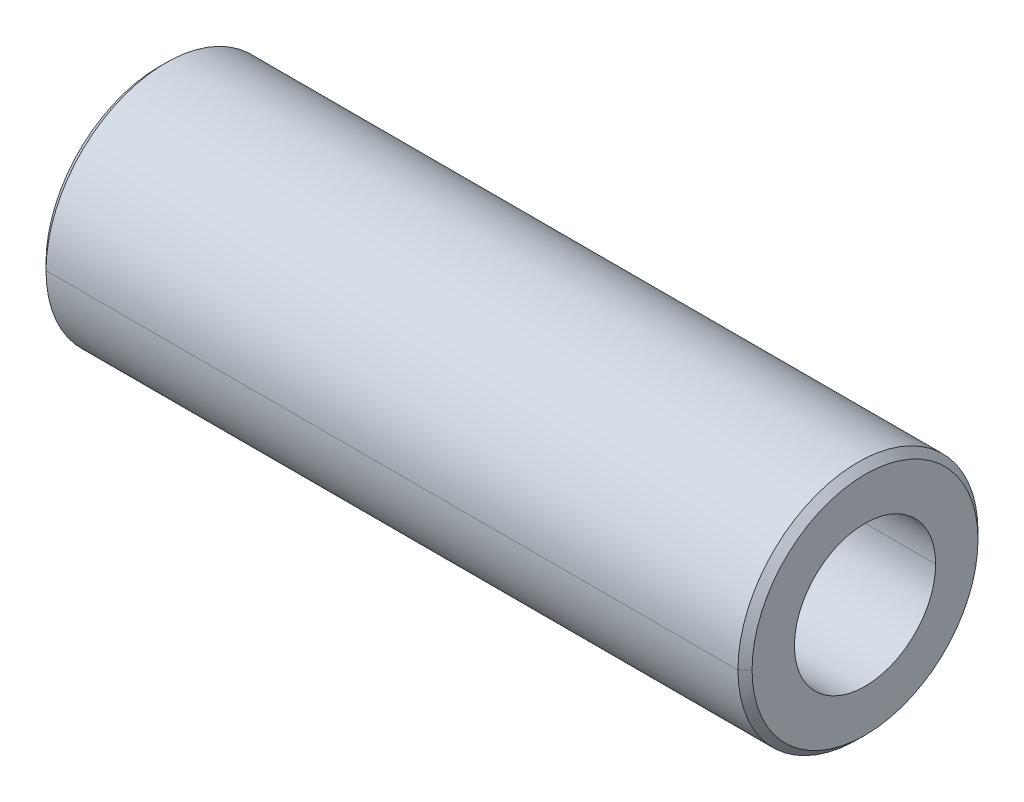
ISO-10303-21;
HEADER;
FILE_DESCRIPTION(('STEP AP214'),'2;1');
FILE_NAME('part.step','',(''),(''),'','','');
FILE_SCHEMA(('AUTOMOTIVE_DESIGN { 1 0 10303 214 1 1 1 1 }'));
ENDSEC;
DATA;
#1=APPLICATION_CONTEXT('core data for automotive mechanical design processes');
#2=APPLICATION_PROTOCOL_DEFINITION('international standard','automotive_design',2000,#1);
#3=PRODUCT_CONTEXT('',#1,'mechanical');
#4=PRODUCT('Part','Part','',(#3));
#5=PRODUCT_RELATED_PRODUCT_CATEGORY('part','',(#4));
#6=PRODUCT_DEFINITION_FORMATION('','',#4);
#7=PRODUCT_DEFINITION_CONTEXT('part definition',#1,'design');
#8=PRODUCT_DEFINITION('design','',#6,#7);
#9=PRODUCT_DEFINITION_SHAPE('','',#8);
#10=(LENGTH_UNIT() NAMED_UNIT(*) SI_UNIT(.MILLI.,.METRE.));
#11=(NAMED_UNIT(*) PLANE_ANGLE_UNIT() SI_UNIT($,.RADIAN.));
#12=(NAMED_UNIT(*) SI_UNIT($,.STERADIAN.) SOLID_ANGLE_UNIT());
#13=UNCERTAINTY_MEASURE_WITH_UNIT(LENGTH_MEASURE(1.E-05),#10,'distance_accuracy_value','');
#14=(GEOMETRIC_REPRESENTATION_CONTEXT(3) GLOBAL_UNCERTAINTY_ASSIGNED_CONTEXT((#13)) GLOBAL_UNIT_ASSIGNED_CONTEXT((#10,
#11,#12)) REPRESENTATION_CONTEXT('',''));
#15=CARTESIAN_POINT('',(0.,0.,0.));
#16=DIRECTION('',(0.,0.,1.));
#17=DIRECTION('',(1.,0.,0.));
#18=AXIS2_PLACEMENT_3D('',#15,#16,#17);
#19=CARTESIAN_POINT('',(0.,8.,0.));
#20=DIRECTION('',(-1.,0.,0.));
#21=DIRECTION('',(0.,0.,1.));
#22=AXIS2_PLACEMENT_3D('',#19,#20,#21);
#23=PLANE('',#22);
#24=CARTESIAN_POINT('',(0.,0.,0.));
#25=DIRECTION('',(1.,0.,0.));
#26=DIRECTION('',(0.,0.,-1.));
#27=AXIS2_PLACEMENT_3D('',#24,#25,#26);
#28=CIRCLE('',#27,5.);
#29=CARTESIAN_POINT('',(0.,0.,-5.));
#30=VERTEX_POINT('',#29);
#31=CARTESIAN_POINT('',(0.,0.,5.));
#32=VERTEX_POINT('',#31);
#33=EDGE_CURVE('E10',#30,#32,#28,.T.);
#34=ORIENTED_EDGE('',*,*,#33,.T.);
#35=CARTESIAN_POINT('',(0.,0.,0.));
#36=DIRECTION('',(1.,0.,0.));
#37=DIRECTION('',(0.,0.,-1.));
#38=AXIS2_PLACEMENT_3D('',#35,#36,#37);
#39=CIRCLE('',#38,5.);
#40=EDGE_CURVE('E24',#32,#30,#39,.T.);
#41=ORIENTED_EDGE('',*,*,#40,.T.);
#42=EDGE_LOOP('',(#34,#41));
#43=FACE_BOUND('',#42,.T.);
#44=CARTESIAN_POINT('',(0.,0.,0.));
#45=DIRECTION('',(1.,0.,0.));
#46=DIRECTION('',(0.,0.,-1.));
#47=AXIS2_PLACEMENT_3D('',#44,#45,#46);
#48=CIRCLE('',#47,8.);
#49=CARTESIAN_POINT('',(0.,0.,-8.));
#50=VERTEX_POINT('',#49);
#51=CARTESIAN_POINT('',(1.275812788748E-12,0.,7.99999999999872));
#52=VERTEX_POINT('',#51);
#53=EDGE_CURVE('E277',#50,#52,#48,.T.);
#54=ORIENTED_EDGE('',*,*,#53,.F.);
#55=CARTESIAN_POINT('',(0.,0.,0.));
#56=DIRECTION('',(1.,0.,0.));
#57=DIRECTION('',(0.,0.,-1.));
#58=AXIS2_PLACEMENT_3D('',#55,#56,#57);
#59=CIRCLE('',#58,8.);
#60=EDGE_CURVE('E275',#52,#50,#59,.T.);
#61=ORIENTED_EDGE('',*,*,#60,.F.);
#62=EDGE_LOOP('',(#54,#61));
#63=FACE_BOUND('',#62,.T.);
#64=ADVANCED_FACE('F16',(#43,#63),#23,.T.);
#65=CARTESIAN_POINT('',(0.5,0.,0.));
#66=DIRECTION('',(1.,0.,0.));
#67=DIRECTION('',(0.,1.,0.));
#68=AXIS2_PLACEMENT_3D('',#65,#66,#67);
#69=CONICAL_SURFACE('',#68,8.5,0.7853981634);
#70=ORIENTED_EDGE('',*,*,#60,.T.);
#71=CARTESIAN_POINT('',(1.27578069636369E-12,0.,-7.99999999999873));
#72=DIRECTION('',(0.707106781184744,0.,-0.707106781188352));
#73=VECTOR('',#72,1.);
#74=LINE('',#71,#73);
#75=CARTESIAN_POINT('',(0.5,0.,-8.5));
#76=VERTEX_POINT('',#75);
#77=EDGE_CURVE('E245',#50,#76,#74,.T.);
#78=ORIENTED_EDGE('',*,*,#77,.T.);
#79=CARTESIAN_POINT('',(0.5,0.,0.));
#80=DIRECTION('',(1.,0.,0.));
#81=DIRECTION('',(0.,0.,-1.));
#82=AXIS2_PLACEMENT_3D('',#79,#80,#81);
#83=CIRCLE('',#82,8.5);
#84=CARTESIAN_POINT('',(0.5,0.,8.5));
#85=VERTEX_POINT('',#84);
#86=EDGE_CURVE('E262',#85,#76,#83,.T.);
#87=ORIENTED_EDGE('',*,*,#86,.F.);
#88=CARTESIAN_POINT('',(1.27578069636369E-12,0.,7.99999999999873));
#89=DIRECTION('',(0.707106781184744,0.,0.707106781188352));
#90=VECTOR('',#89,1.);
#91=LINE('',#88,#90);
#92=EDGE_CURVE('E247',#52,#85,#91,.T.);
#93=ORIENTED_EDGE('',*,*,#92,.F.);
#94=EDGE_LOOP('',(#70,#78,#87,#93));
#95=FACE_BOUND('',#94,.T.);
#96=ADVANCED_FACE('F229',(#95),#69,.T.);
#97=CARTESIAN_POINT('',(0.5,0.,0.));
#98=DIRECTION('',(1.,0.,0.));
#99=DIRECTION('',(0.,-1.,0.));
#100=AXIS2_PLACEMENT_3D('',#97,#98,#99);
#101=CONICAL_SURFACE('',#100,8.5,0.7853981634);
#102=CARTESIAN_POINT('',(0.5,0.,0.));
#103=DIRECTION('',(1.,0.,0.));
#104=DIRECTION('',(0.,0.,-1.));
#105=AXIS2_PLACEMENT_3D('',#102,#103,#104);
#106=CIRCLE('',#105,8.5);
#107=EDGE_CURVE('E213',#76,#85,#106,.T.);
#108=ORIENTED_EDGE('',*,*,#107,.F.);
#109=ORIENTED_EDGE('',*,*,#77,.F.);
#110=ORIENTED_EDGE('',*,*,#53,.T.);
#111=ORIENTED_EDGE('',*,*,#92,.T.);
#112=EDGE_LOOP('',(#108,#109,#110,#111));
#113=FACE_BOUND('',#112,.T.);
#114=ADVANCED_FACE('F221',(#113),#101,.T.);
#115=CARTESIAN_POINT('',(50.,0.,0.));
#116=DIRECTION('',(-1.,0.,0.));
#117=DIRECTION('',(0.,-1.,0.));
#118=AXIS2_PLACEMENT_3D('',#115,#116,#117);
#119=CYLINDRICAL_SURFACE('',#118,8.5);
#120=CARTESIAN_POINT('',(49.5,0.,0.));
#121=DIRECTION('',(1.,0.,0.));
#122=DIRECTION('',(0.,0.,-1.));
#123=AXIS2_PLACEMENT_3D('',#120,#121,#122);
#124=CIRCLE('',#123,8.5);
#125=CARTESIAN_POINT('',(49.5,0.,-8.5));
#126=VERTEX_POINT('',#125);
#127=CARTESIAN_POINT('',(49.5000000000013,0.,8.50000000000128));
#128=VERTEX_POINT('',#127);
#129=EDGE_CURVE('E211',#126,#128,#124,.T.);
#130=ORIENTED_EDGE('',*,*,#129,.F.);
#131=CARTESIAN_POINT('',(49.5,0.,-8.5));
#132=DIRECTION('',(-1.,0.,0.));
#133=VECTOR('',#132,1.);
#134=LINE('',#131,#133);
#135=EDGE_CURVE('E189',#126,#76,#134,.T.);
#136=ORIENTED_EDGE('',*,*,#135,.T.);
#137=ORIENTED_EDGE('',*,*,#107,.T.);
#138=CARTESIAN_POINT('',(49.5,0.,8.5));
#139=DIRECTION('',(-1.,0.,0.));
#140=VECTOR('',#139,1.);
#141=LINE('',#138,#140);
#142=EDGE_CURVE('E201',#128,#85,#141,.T.);
#143=ORIENTED_EDGE('',*,*,#142,.F.);
#144=EDGE_LOOP('',(#130,#136,#137,#143));
#145=FACE_BOUND('',#144,.T.);
#146=ADVANCED_FACE('F168',(#145),#119,.T.);
#147=CARTESIAN_POINT('',(50.,0.,0.));
#148=DIRECTION('',(-1.,0.,0.));
#149=DIRECTION('',(0.,1.,0.));
#150=AXIS2_PLACEMENT_3D('',#147,#148,#149);
#151=CYLINDRICAL_SURFACE('',#150,8.5);
#152=ORIENTED_EDGE('',*,*,#86,.T.);
#153=ORIENTED_EDGE('',*,*,#135,.F.);
#154=CARTESIAN_POINT('',(49.5,0.,0.));
#155=DIRECTION('',(1.,0.,0.));
#156=DIRECTION('',(0.,0.,-1.));
#157=AXIS2_PLACEMENT_3D('',#154,#155,#156);
#158=CIRCLE('',#157,8.5);
#159=EDGE_CURVE('E421',#128,#126,#158,.T.);
#160=ORIENTED_EDGE('',*,*,#159,.F.);
#161=ORIENTED_EDGE('',*,*,#142,.T.);
#162=EDGE_LOOP('',(#152,#153,#160,#161));
#163=FACE_BOUND('',#162,.T.);
#164=ADVANCED_FACE('F159',(#163),#151,.T.);
#165=CARTESIAN_POINT('',(50.,0.,0.));
#166=DIRECTION('',(-1.,0.,0.));
#167=DIRECTION('',(0.,1.,0.));
#168=AXIS2_PLACEMENT_3D('',#165,#166,#167);
#169=CONICAL_SURFACE('',#168,8.,0.7853981634);
#170=ORIENTED_EDGE('',*,*,#159,.T.);
#171=CARTESIAN_POINT('',(50.,0.,-8.));
#172=DIRECTION('',(-0.707106781184743,0.,-0.707106781188352));
#173=VECTOR('',#172,1.);
#174=LINE('',#171,#173);
#175=CARTESIAN_POINT('',(50.,0.,-8.));
#176=VERTEX_POINT('',#175);
#177=EDGE_CURVE('E124',#176,#126,#174,.T.);
#178=ORIENTED_EDGE('',*,*,#177,.F.);
#179=CARTESIAN_POINT('',(50.,0.,0.));
#180=DIRECTION('',(1.,0.,0.));
#181=DIRECTION('',(0.,0.,-1.));
#182=AXIS2_PLACEMENT_3D('',#179,#180,#181);
#183=CIRCLE('',#182,8.);
#184=CARTESIAN_POINT('',(50.,0.,8.));
#185=VERTEX_POINT('',#184);
#186=EDGE_CURVE('E140',#185,#176,#183,.T.);
#187=ORIENTED_EDGE('',*,*,#186,.F.);
#188=CARTESIAN_POINT('',(50.,0.,8.));
#189=DIRECTION('',(-0.707106781184743,0.,0.707106781188352));
#190=VECTOR('',#189,1.);
#191=LINE('',#188,#190);
#192=EDGE_CURVE('E84',#185,#128,#191,.T.);
#193=ORIENTED_EDGE('',*,*,#192,.T.);
#194=EDGE_LOOP('',(#170,#178,#187,#193));
#195=FACE_BOUND('',#194,.T.);
#196=ADVANCED_FACE('F107',(#195),#169,.T.);
#197=CARTESIAN_POINT('',(50.,0.,0.));
#198=DIRECTION('',(-1.,0.,0.));
#199=DIRECTION('',(0.,-1.,0.));
#200=AXIS2_PLACEMENT_3D('',#197,#198,#199);
#201=CONICAL_SURFACE('',#200,8.,0.7853981634);
#202=CARTESIAN_POINT('',(50.,0.,0.));
#203=DIRECTION('',(1.,0.,0.));
#204=DIRECTION('',(0.,0.,-1.));
#205=AXIS2_PLACEMENT_3D('',#202,#203,#204);
#206=CIRCLE('',#205,8.);
#207=EDGE_CURVE('E81',#176,#185,#206,.T.);
#208=ORIENTED_EDGE('',*,*,#207,.F.);
#209=ORIENTED_EDGE('',*,*,#177,.T.);
#210=ORIENTED_EDGE('',*,*,#129,.T.);
#211=ORIENTED_EDGE('',*,*,#192,.F.);
#212=EDGE_LOOP('',(#208,#209,#210,#211));
#213=FACE_BOUND('',#212,.T.);
#214=ADVANCED_FACE('F97',(#213),#201,.T.);
#215=CARTESIAN_POINT('',(50.,5.,0.));
#216=DIRECTION('',(1.,0.,0.));
#217=DIRECTION('',(0.,0.,-1.));
#218=AXIS2_PLACEMENT_3D('',#215,#216,#217);
#219=PLANE('',#218);
#220=ORIENTED_EDGE('',*,*,#207,.T.);
#221=ORIENTED_EDGE('',*,*,#186,.T.);
#222=EDGE_LOOP('',(#220,#221));
#223=FACE_BOUND('',#222,.T.);
#224=CARTESIAN_POINT('',(50.,0.,0.));
#225=DIRECTION('',(1.,0.,0.));
#226=DIRECTION('',(0.,0.,-1.));
#227=AXIS2_PLACEMENT_3D('',#224,#225,#226);
#228=CIRCLE('',#227,5.);
#229=CARTESIAN_POINT('',(50.,0.,-5.));
#230=VERTEX_POINT('',#229);
#231=CARTESIAN_POINT('',(50.,0.,5.));
#232=VERTEX_POINT('',#231);
#233=EDGE_CURVE('E67',#230,#232,#228,.T.);
#234=ORIENTED_EDGE('',*,*,#233,.F.);
#235=CARTESIAN_POINT('',(50.,0.,0.));
#236=DIRECTION('',(1.,0.,0.));
#237=DIRECTION('',(0.,0.,-1.));
#238=AXIS2_PLACEMENT_3D('',#235,#236,#237);
#239=CIRCLE('',#238,5.);
#240=EDGE_CURVE('E63',#232,#230,#239,.T.);
#241=ORIENTED_EDGE('',*,*,#240,.F.);
#242=EDGE_LOOP('',(#234,#241));
#243=FACE_BOUND('',#242,.T.);
#244=ADVANCED_FACE('F65',(#223,#243),#219,.T.);
#245=CARTESIAN_POINT('',(50.,0.,0.));
#246=DIRECTION('',(-1.,0.,0.));
#247=DIRECTION('',(0.,1.,0.));
#248=AXIS2_PLACEMENT_3D('',#245,#246,#247);
#249=CYLINDRICAL_SURFACE('',#248,5.);
#250=ORIENTED_EDGE('',*,*,#40,.F.);
#251=CARTESIAN_POINT('',(50.,0.,5.));
#252=DIRECTION('',(-1.,0.,0.));
#253=VECTOR('',#252,1.);
#254=LINE('',#251,#253);
#255=EDGE_CURVE('E70',#232,#32,#254,.T.);
#256=ORIENTED_EDGE('',*,*,#255,.F.);
#257=ORIENTED_EDGE('',*,*,#240,.T.);
#258=CARTESIAN_POINT('',(50.,0.,-5.));
#259=DIRECTION('',(-1.,0.,0.));
#260=VECTOR('',#259,1.);
#261=LINE('',#258,#260);
#262=EDGE_CURVE('E77',#230,#30,#261,.T.);
#263=ORIENTED_EDGE('',*,*,#262,.T.);
#264=EDGE_LOOP('',(#250,#256,#257,#263));
#265=FACE_BOUND('',#264,.T.);
#266=ADVANCED_FACE('F74',(#265),#249,.F.);
#267=CARTESIAN_POINT('',(50.,0.,0.));
#268=DIRECTION('',(-1.,0.,0.));
#269=DIRECTION('',(0.,-1.,0.));
#270=AXIS2_PLACEMENT_3D('',#267,#268,#269);
#271=CYLINDRICAL_SURFACE('',#270,5.);
#272=ORIENTED_EDGE('',*,*,#233,.T.);
#273=ORIENTED_EDGE('',*,*,#255,.T.);
#274=ORIENTED_EDGE('',*,*,#33,.F.);
#275=ORIENTED_EDGE('',*,*,#262,.F.);
#276=EDGE_LOOP('',(#272,#273,#274,#275));
#277=FACE_BOUND('',#276,.T.);
#278=ADVANCED_FACE('F79',(#277),#271,.F.);
#279=CLOSED_SHELL('',(#64,#96,#114,#146,#164,#196,#214,#244,#266,#278));
#280=MANIFOLD_SOLID_BREP('B1',#279);
#281=ADVANCED_BREP_SHAPE_REPRESENTATION('',(#18,#280),#14);
#282=SHAPE_DEFINITION_REPRESENTATION(#9,#281);
ENDSEC;
END-ISO-10303-21;
